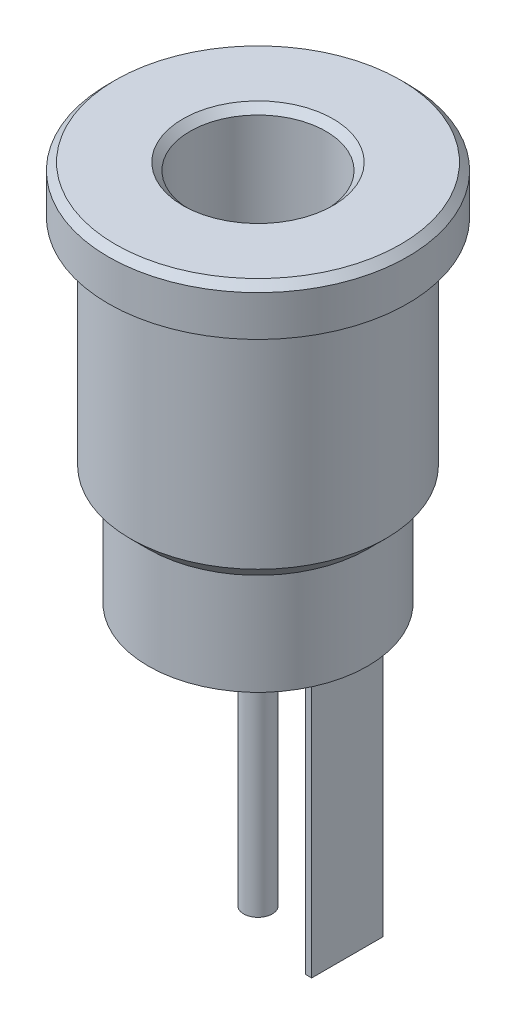
ISO-10303-21;
HEADER;
FILE_DESCRIPTION(('STEP AP214'),'2;1');
FILE_NAME('part.step','',(''),(''),'','','');
FILE_SCHEMA(('AUTOMOTIVE_DESIGN { 1 0 10303 214 1 1 1 1 }'));
ENDSEC;
DATA;
#1=APPLICATION_CONTEXT('core data for automotive mechanical design processes');
#2=APPLICATION_PROTOCOL_DEFINITION('international standard','automotive_design',2000,#1);
#3=PRODUCT_CONTEXT('',#1,'mechanical');
#4=PRODUCT('Part','Part','',(#3));
#5=PRODUCT_RELATED_PRODUCT_CATEGORY('part','',(#4));
#6=PRODUCT_DEFINITION_FORMATION('','',#4);
#7=PRODUCT_DEFINITION_CONTEXT('part definition',#1,'design');
#8=PRODUCT_DEFINITION('design','',#6,#7);
#9=PRODUCT_DEFINITION_SHAPE('','',#8);
#10=(LENGTH_UNIT() NAMED_UNIT(*) SI_UNIT(.MILLI.,.METRE.));
#11=(NAMED_UNIT(*) PLANE_ANGLE_UNIT() SI_UNIT($,.RADIAN.));
#12=(NAMED_UNIT(*) SI_UNIT($,.STERADIAN.) SOLID_ANGLE_UNIT());
#13=UNCERTAINTY_MEASURE_WITH_UNIT(LENGTH_MEASURE(1.E-05),#10,'distance_accuracy_value','');
#14=(GEOMETRIC_REPRESENTATION_CONTEXT(3) GLOBAL_UNCERTAINTY_ASSIGNED_CONTEXT((#13)) GLOBAL_UNIT_ASSIGNED_CONTEXT((#10,
#11,#12)) REPRESENTATION_CONTEXT('',''));
#15=CARTESIAN_POINT('',(0.,0.,0.));
#16=DIRECTION('',(0.,0.,1.));
#17=DIRECTION('',(1.,0.,0.));
#18=AXIS2_PLACEMENT_3D('',#15,#16,#17);
#19=CARTESIAN_POINT('',(0.,0.,0.));
#20=DIRECTION('',(0.,1.,0.));
#21=DIRECTION('',(0.,0.,1.));
#22=AXIS2_PLACEMENT_3D('',#19,#20,#21);
#23=PLANE('',#22);
#24=CARTESIAN_POINT('',(0.,0.,0.));
#25=DIRECTION('',(0.,1.,0.));
#26=DIRECTION('',(0.,0.,1.));
#27=AXIS2_PLACEMENT_3D('',#24,#25,#26);
#28=CIRCLE('',#27,0.6);
#29=CARTESIAN_POINT('',(0.,0.,0.6));
#30=VERTEX_POINT('',#29);
#31=EDGE_CURVE('E12',#30,#30,#28,.F.);
#32=ORIENTED_EDGE('',*,*,#31,.F.);
#33=EDGE_LOOP('',(#32));
#34=FACE_BOUND('',#33,.T.);
#35=CARTESIAN_POINT('',(0.,0.,0.));
#36=DIRECTION('',(0.,-1.,0.));
#37=DIRECTION('',(0.,0.,-1.));
#38=AXIS2_PLACEMENT_3D('',#35,#36,#37);
#39=CIRCLE('',#38,4.6);
#40=CARTESIAN_POINT('',(0.,0.,-4.6));
#41=VERTEX_POINT('',#40);
#42=EDGE_CURVE('E101',#41,#41,#39,.T.);
#43=ORIENTED_EDGE('',*,*,#42,.T.);
#44=EDGE_LOOP('',(#43));
#45=FACE_BOUND('',#44,.T.);
#46=DIRECTION('',(0.,0.,1.));
#47=VECTOR('',#46,1.);
#48=CARTESIAN_POINT('',(3.75,0.,1.5));
#49=LINE('',#48,#47);
#50=CARTESIAN_POINT('',(3.75,0.,-1.5));
#51=VERTEX_POINT('',#50);
#52=CARTESIAN_POINT('',(3.75,0.,1.5));
#53=VERTEX_POINT('',#52);
#54=EDGE_CURVE('E100',#51,#53,#49,.T.);
#55=ORIENTED_EDGE('',*,*,#54,.F.);
#56=DIRECTION('',(1.,0.,0.));
#57=VECTOR('',#56,1.);
#58=CARTESIAN_POINT('',(3.5,0.,-1.5));
#59=LINE('',#58,#57);
#60=CARTESIAN_POINT('',(3.5,0.,-1.5));
#61=VERTEX_POINT('',#60);
#62=EDGE_CURVE('E97',#61,#51,#59,.T.);
#63=ORIENTED_EDGE('',*,*,#62,.F.);
#64=DIRECTION('',(0.,0.,-1.));
#65=VECTOR('',#64,1.);
#66=CARTESIAN_POINT('',(3.5,0.,1.5));
#67=LINE('',#66,#65);
#68=CARTESIAN_POINT('',(3.5,0.,1.5));
#69=VERTEX_POINT('',#68);
#70=EDGE_CURVE('E59',#69,#61,#67,.T.);
#71=ORIENTED_EDGE('',*,*,#70,.F.);
#72=DIRECTION('',(-1.,0.,0.));
#73=VECTOR('',#72,1.);
#74=CARTESIAN_POINT('',(3.5,0.,1.5));
#75=LINE('',#74,#73);
#76=EDGE_CURVE('E54',#53,#69,#75,.T.);
#77=ORIENTED_EDGE('',*,*,#76,.F.);
#78=EDGE_LOOP('',(#55,#63,#71,#77));
#79=FACE_BOUND('',#78,.T.);
#80=ADVANCED_FACE('F38',(#34,#45,#79),#23,.F.);
#81=CARTESIAN_POINT('',(0.,14.,0.));
#82=DIRECTION('',(0.,-1.,0.));
#83=DIRECTION('',(0.,0.,-1.));
#84=AXIS2_PLACEMENT_3D('',#81,#82,#83);
#85=CYLINDRICAL_SURFACE('',#84,5.35);
#86=CARTESIAN_POINT('',(0.,5.00000000000001,0.));
#87=DIRECTION('',(0.,-1.,0.));
#88=DIRECTION('',(0.,0.,-1.));
#89=AXIS2_PLACEMENT_3D('',#86,#87,#88);
#90=CIRCLE('',#89,5.35);
#91=CARTESIAN_POINT('',(0.,5.00000000000001,-5.35));
#92=VERTEX_POINT('',#91);
#93=EDGE_CURVE('E136',#92,#92,#90,.F.);
#94=ORIENTED_EDGE('',*,*,#93,.T.);
#95=EDGE_LOOP('',(#94));
#96=FACE_BOUND('',#95,.T.);
#97=CARTESIAN_POINT('',(0.,14.,0.));
#98=DIRECTION('',(0.,1.,0.));
#99=DIRECTION('',(0.,0.,1.));
#100=AXIS2_PLACEMENT_3D('',#97,#98,#99);
#101=CIRCLE('',#100,5.35);
#102=CARTESIAN_POINT('',(0.,14.,5.35));
#103=VERTEX_POINT('',#102);
#104=EDGE_CURVE('E118',#103,#103,#101,.T.);
#105=ORIENTED_EDGE('',*,*,#104,.F.);
#106=EDGE_LOOP('',(#105));
#107=FACE_BOUND('',#106,.T.);
#108=ADVANCED_FACE('F155',(#96,#107),#85,.T.);
#109=CARTESIAN_POINT('',(0.,16.,0.));
#110=DIRECTION('',(0.,-1.,0.));
#111=DIRECTION('',(0.,0.,-1.));
#112=AXIS2_PLACEMENT_3D('',#109,#110,#111);
#113=CYLINDRICAL_SURFACE('',#112,6.275);
#114=CARTESIAN_POINT('',(0.,15.7,0.));
#115=DIRECTION('',(0.,1.,0.));
#116=DIRECTION('',(0.,0.,1.));
#117=AXIS2_PLACEMENT_3D('',#114,#115,#116);
#118=CIRCLE('',#117,6.275);
#119=CARTESIAN_POINT('',(0.,15.7,6.275));
#120=VERTEX_POINT('',#119);
#121=EDGE_CURVE('E130',#120,#120,#118,.F.);
#122=ORIENTED_EDGE('',*,*,#121,.T.);
#123=EDGE_LOOP('',(#122));
#124=FACE_BOUND('',#123,.T.);
#125=CARTESIAN_POINT('',(0.,14.,0.));
#126=DIRECTION('',(0.,1.,0.));
#127=DIRECTION('',(0.,0.,1.));
#128=AXIS2_PLACEMENT_3D('',#125,#126,#127);
#129=CIRCLE('',#128,6.275);
#130=CARTESIAN_POINT('',(0.,14.,6.275));
#131=VERTEX_POINT('',#130);
#132=EDGE_CURVE('E115',#131,#131,#129,.T.);
#133=ORIENTED_EDGE('',*,*,#132,.T.);
#134=EDGE_LOOP('',(#133));
#135=FACE_BOUND('',#134,.T.);
#136=ADVANCED_FACE('F161',(#124,#135),#113,.T.);
#137=CARTESIAN_POINT('',(0.,16.,0.));
#138=DIRECTION('',(0.,1.,0.));
#139=DIRECTION('',(0.,0.,1.));
#140=AXIS2_PLACEMENT_3D('',#137,#138,#139);
#141=PLANE('',#140);
#142=CARTESIAN_POINT('',(0.,16.,0.));
#143=DIRECTION('',(0.,1.,0.));
#144=DIRECTION('',(0.,0.,1.));
#145=AXIS2_PLACEMENT_3D('',#142,#143,#144);
#146=CIRCLE('',#145,5.975);
#147=CARTESIAN_POINT('',(0.,16.,5.975));
#148=VERTEX_POINT('',#147);
#149=EDGE_CURVE('E127',#148,#148,#146,.T.);
#150=ORIENTED_EDGE('',*,*,#149,.T.);
#151=EDGE_LOOP('',(#150));
#152=FACE_BOUND('',#151,.T.);
#153=CARTESIAN_POINT('',(0.,16.,0.));
#154=DIRECTION('',(0.,1.,0.));
#155=DIRECTION('',(0.,0.,1.));
#156=AXIS2_PLACEMENT_3D('',#153,#154,#155);
#157=CIRCLE('',#156,3.15);
#158=CARTESIAN_POINT('',(0.,16.,3.15));
#159=VERTEX_POINT('',#158);
#160=EDGE_CURVE('E124',#159,#159,#157,.F.);
#161=ORIENTED_EDGE('',*,*,#160,.T.);
#162=EDGE_LOOP('',(#161));
#163=FACE_BOUND('',#162,.T.);
#164=ADVANCED_FACE('F209',(#152,#163),#141,.T.);
#165=CARTESIAN_POINT('',(0.,14.,0.));
#166=DIRECTION('',(0.,1.,0.));
#167=DIRECTION('',(0.,0.,1.));
#168=AXIS2_PLACEMENT_3D('',#165,#166,#167);
#169=PLANE('',#168);
#170=ORIENTED_EDGE('',*,*,#104,.T.);
#171=EDGE_LOOP('',(#170));
#172=FACE_BOUND('',#171,.T.);
#173=ORIENTED_EDGE('',*,*,#132,.F.);
#174=EDGE_LOOP('',(#173));
#175=FACE_BOUND('',#174,.T.);
#176=ADVANCED_FACE('F195',(#172,#175),#169,.F.);
#177=CARTESIAN_POINT('',(0.,4.1,0.));
#178=DIRECTION('',(0.,1.,0.));
#179=DIRECTION('',(0.,0.,1.));
#180=AXIS2_PLACEMENT_3D('',#177,#178,#179);
#181=CYLINDRICAL_SURFACE('',#180,2.85);
#182=CARTESIAN_POINT('',(0.,15.7,0.));
#183=DIRECTION('',(0.,1.,0.));
#184=DIRECTION('',(0.,0.,1.));
#185=AXIS2_PLACEMENT_3D('',#182,#183,#184);
#186=CIRCLE('',#185,2.85);
#187=CARTESIAN_POINT('',(0.,15.7,2.85));
#188=VERTEX_POINT('',#187);
#189=EDGE_CURVE('E133',#188,#188,#186,.T.);
#190=ORIENTED_EDGE('',*,*,#189,.T.);
#191=EDGE_LOOP('',(#190));
#192=FACE_BOUND('',#191,.T.);
#193=CARTESIAN_POINT('',(0.,4.1,0.));
#194=DIRECTION('',(0.,1.,0.));
#195=DIRECTION('',(0.,0.,1.));
#196=AXIS2_PLACEMENT_3D('',#193,#194,#195);
#197=CIRCLE('',#196,2.85);
#198=CARTESIAN_POINT('',(0.,4.1,2.85));
#199=VERTEX_POINT('',#198);
#200=EDGE_CURVE('E112',#199,#199,#197,.T.);
#201=ORIENTED_EDGE('',*,*,#200,.F.);
#202=EDGE_LOOP('',(#201));
#203=FACE_BOUND('',#202,.T.);
#204=ADVANCED_FACE('F191',(#192,#203),#181,.F.);
#205=CARTESIAN_POINT('',(0.,4.1,0.));
#206=DIRECTION('',(0.,1.,0.));
#207=DIRECTION('',(0.,0.,1.));
#208=AXIS2_PLACEMENT_3D('',#205,#206,#207);
#209=PLANE('',#208);
#210=CARTESIAN_POINT('',(0.,4.1,0.));
#211=DIRECTION('',(0.,1.,0.));
#212=DIRECTION('',(0.,0.,1.));
#213=AXIS2_PLACEMENT_3D('',#210,#211,#212);
#214=CIRCLE('',#213,1.);
#215=CARTESIAN_POINT('',(0.,4.1,1.));
#216=VERTEX_POINT('',#215);
#217=EDGE_CURVE('E104',#216,#216,#214,.T.);
#218=ORIENTED_EDGE('',*,*,#217,.F.);
#219=EDGE_LOOP('',(#218));
#220=FACE_BOUND('',#219,.T.);
#221=ORIENTED_EDGE('',*,*,#200,.T.);
#222=EDGE_LOOP('',(#221));
#223=FACE_BOUND('',#222,.T.);
#224=ADVANCED_FACE('F194',(#220,#223),#209,.T.);
#225=CARTESIAN_POINT('',(0.,18.8284271247462,0.));
#226=DIRECTION('',(0.,-1.,0.));
#227=DIRECTION('',(0.,0.,-1.));
#228=AXIS2_PLACEMENT_3D('',#225,#226,#227);
#229=CYLINDRICAL_SURFACE('',#228,1.);
#230=CARTESIAN_POINT('',(0.,12.,0.));
#231=DIRECTION('',(0.,-1.,0.));
#232=DIRECTION('',(0.,0.,-1.));
#233=AXIS2_PLACEMENT_3D('',#230,#231,#232);
#234=CIRCLE('',#233,1.);
#235=CARTESIAN_POINT('',(0.,12.,-1.));
#236=VERTEX_POINT('',#235);
#237=EDGE_CURVE('E121',#236,#236,#234,.T.);
#238=ORIENTED_EDGE('',*,*,#237,.T.);
#239=EDGE_LOOP('',(#238));
#240=FACE_BOUND('',#239,.T.);
#241=ORIENTED_EDGE('',*,*,#217,.T.);
#242=EDGE_LOOP('',(#241));
#243=FACE_BOUND('',#242,.T.);
#244=ADVANCED_FACE('F173',(#240,#243),#229,.T.);
#245=CARTESIAN_POINT('',(0.,12.,0.));
#246=DIRECTION('',(0.,1.,0.));
#247=DIRECTION('',(0.,0.,1.));
#248=AXIS2_PLACEMENT_3D('',#245,#246,#247);
#249=SPHERICAL_SURFACE('',#248,1.);
#250=ORIENTED_EDGE('',*,*,#237,.F.);
#251=EDGE_LOOP('',(#250));
#252=FACE_BOUND('',#251,.T.);
#253=ADVANCED_FACE('F169',(#252),#249,.T.);
#254=CARTESIAN_POINT('',(0.,16.,0.));
#255=DIRECTION('',(0.,-1.,0.));
#256=DIRECTION('',(0.,0.,-1.));
#257=AXIS2_PLACEMENT_3D('',#254,#255,#256);
#258=CONICAL_SURFACE('',#257,5.975,0.785398163397444);
#259=ORIENTED_EDGE('',*,*,#121,.F.);
#260=EDGE_LOOP('',(#259));
#261=FACE_BOUND('',#260,.T.);
#262=ORIENTED_EDGE('',*,*,#149,.F.);
#263=EDGE_LOOP('',(#262));
#264=FACE_BOUND('',#263,.T.);
#265=ADVANCED_FACE('F172',(#261,#264),#258,.T.);
#266=CARTESIAN_POINT('',(0.,15.7,0.));
#267=DIRECTION('',(0.,1.,0.));
#268=DIRECTION('',(0.,0.,1.));
#269=AXIS2_PLACEMENT_3D('',#266,#267,#268);
#270=CONICAL_SURFACE('',#269,2.85,0.785398163397445);
#271=ORIENTED_EDGE('',*,*,#160,.F.);
#272=EDGE_LOOP('',(#271));
#273=FACE_BOUND('',#272,.T.);
#274=ORIENTED_EDGE('',*,*,#189,.F.);
#275=EDGE_LOOP('',(#274));
#276=FACE_BOUND('',#275,.T.);
#277=ADVANCED_FACE('F151',(#273,#276),#270,.F.);
#278=CARTESIAN_POINT('',(0.,4.,0.));
#279=DIRECTION('',(0.,-1.,0.));
#280=DIRECTION('',(0.,0.,-1.));
#281=AXIS2_PLACEMENT_3D('',#278,#279,#280);
#282=CYLINDRICAL_SURFACE('',#281,4.6);
#283=CARTESIAN_POINT('',(0.,4.25000000000001,0.));
#284=DIRECTION('',(0.,1.,0.));
#285=DIRECTION('',(0.,0.,1.));
#286=AXIS2_PLACEMENT_3D('',#283,#284,#285);
#287=CIRCLE('',#286,4.6);
#288=CARTESIAN_POINT('',(0.,4.25000000000001,4.6));
#289=VERTEX_POINT('',#288);
#290=EDGE_CURVE('E47',#289,#289,#287,.F.);
#291=ORIENTED_EDGE('',*,*,#290,.T.);
#292=EDGE_LOOP('',(#291));
#293=FACE_BOUND('',#292,.T.);
#294=ORIENTED_EDGE('',*,*,#42,.F.);
#295=EDGE_LOOP('',(#294));
#296=FACE_BOUND('',#295,.T.);
#297=ADVANCED_FACE('F141',(#293,#296),#282,.T.);
#298=CARTESIAN_POINT('',(0.,4.,0.));
#299=DIRECTION('',(0.,1.,0.));
#300=DIRECTION('',(0.,0.,1.));
#301=AXIS2_PLACEMENT_3D('',#298,#299,#300);
#302=CONICAL_SURFACE('',#301,4.34999999999998,0.785398163397454);
#303=ORIENTED_EDGE('',*,*,#93,.F.);
#304=EDGE_LOOP('',(#303));
#305=FACE_BOUND('',#304,.T.);
#306=ORIENTED_EDGE('',*,*,#290,.F.);
#307=EDGE_LOOP('',(#306));
#308=FACE_BOUND('',#307,.T.);
#309=ADVANCED_FACE('F41',(#305,#308),#302,.T.);
#310=CARTESIAN_POINT('',(3.75,-11.,1.5));
#311=DIRECTION('',(-1.,0.,0.));
#312=DIRECTION('',(0.,0.,1.));
#313=AXIS2_PLACEMENT_3D('',#310,#311,#312);
#314=PLANE('',#313);
#315=ORIENTED_EDGE('',*,*,#54,.T.);
#316=DIRECTION('',(0.,1.,0.));
#317=VECTOR('',#316,1.);
#318=CARTESIAN_POINT('',(3.75,-11.,1.5));
#319=LINE('',#318,#317);
#320=CARTESIAN_POINT('',(3.75,-11.,1.5));
#321=VERTEX_POINT('',#320);
#322=EDGE_CURVE('E81',#321,#53,#319,.T.);
#323=ORIENTED_EDGE('',*,*,#322,.F.);
#324=DIRECTION('',(0.,0.,1.));
#325=VECTOR('',#324,1.);
#326=CARTESIAN_POINT('',(3.75,-11.,1.5));
#327=LINE('',#326,#325);
#328=CARTESIAN_POINT('',(3.75,-11.,-1.5));
#329=VERTEX_POINT('',#328);
#330=EDGE_CURVE('E88',#329,#321,#327,.T.);
#331=ORIENTED_EDGE('',*,*,#330,.F.);
#332=DIRECTION('',(0.,1.,0.));
#333=VECTOR('',#332,1.);
#334=CARTESIAN_POINT('',(3.75,-11.,-1.5));
#335=LINE('',#334,#333);
#336=EDGE_CURVE('E345',#329,#51,#335,.T.);
#337=ORIENTED_EDGE('',*,*,#336,.T.);
#338=EDGE_LOOP('',(#315,#323,#331,#337));
#339=FACE_BOUND('',#338,.T.);
#340=ADVANCED_FACE('F99',(#339),#314,.F.);
#341=CARTESIAN_POINT('',(3.5,-11.,1.5));
#342=DIRECTION('',(0.,0.,-1.));
#343=DIRECTION('',(-1.,0.,0.));
#344=AXIS2_PLACEMENT_3D('',#341,#342,#343);
#345=PLANE('',#344);
#346=ORIENTED_EDGE('',*,*,#76,.T.);
#347=DIRECTION('',(0.,1.,0.));
#348=VECTOR('',#347,1.);
#349=CARTESIAN_POINT('',(3.5,-11.,1.5));
#350=LINE('',#349,#348);
#351=CARTESIAN_POINT('',(3.5,-11.,1.5));
#352=VERTEX_POINT('',#351);
#353=EDGE_CURVE('E84',#352,#69,#350,.T.);
#354=ORIENTED_EDGE('',*,*,#353,.F.);
#355=DIRECTION('',(-1.,0.,0.));
#356=VECTOR('',#355,1.);
#357=CARTESIAN_POINT('',(3.5,-11.,1.5));
#358=LINE('',#357,#356);
#359=EDGE_CURVE('E77',#321,#352,#358,.T.);
#360=ORIENTED_EDGE('',*,*,#359,.F.);
#361=ORIENTED_EDGE('',*,*,#322,.T.);
#362=EDGE_LOOP('',(#346,#354,#360,#361));
#363=FACE_BOUND('',#362,.T.);
#364=ADVANCED_FACE('F79',(#363),#345,.F.);
#365=CARTESIAN_POINT('',(3.5,-11.,1.5));
#366=DIRECTION('',(1.,0.,0.));
#367=DIRECTION('',(0.,0.,-1.));
#368=AXIS2_PLACEMENT_3D('',#365,#366,#367);
#369=PLANE('',#368);
#370=ORIENTED_EDGE('',*,*,#70,.T.);
#371=DIRECTION('',(0.,1.,0.));
#372=VECTOR('',#371,1.);
#373=CARTESIAN_POINT('',(3.5,-11.,-1.5));
#374=LINE('',#373,#372);
#375=CARTESIAN_POINT('',(3.5,-11.,-1.5));
#376=VERTEX_POINT('',#375);
#377=EDGE_CURVE('E106',#376,#61,#374,.T.);
#378=ORIENTED_EDGE('',*,*,#377,.F.);
#379=DIRECTION('',(0.,0.,-1.));
#380=VECTOR('',#379,1.);
#381=CARTESIAN_POINT('',(3.5,-11.,1.5));
#382=LINE('',#381,#380);
#383=EDGE_CURVE('E87',#352,#376,#382,.T.);
#384=ORIENTED_EDGE('',*,*,#383,.F.);
#385=ORIENTED_EDGE('',*,*,#353,.T.);
#386=EDGE_LOOP('',(#370,#378,#384,#385));
#387=FACE_BOUND('',#386,.T.);
#388=ADVANCED_FACE('F287',(#387),#369,.F.);
#389=CARTESIAN_POINT('',(3.5,-11.,-1.5));
#390=DIRECTION('',(0.,0.,1.));
#391=DIRECTION('',(1.,0.,0.));
#392=AXIS2_PLACEMENT_3D('',#389,#390,#391);
#393=PLANE('',#392);
#394=ORIENTED_EDGE('',*,*,#62,.T.);
#395=ORIENTED_EDGE('',*,*,#336,.F.);
#396=DIRECTION('',(1.,0.,0.));
#397=VECTOR('',#396,1.);
#398=CARTESIAN_POINT('',(3.5,-11.,-1.5));
#399=LINE('',#398,#397);
#400=EDGE_CURVE('E93',#376,#329,#399,.T.);
#401=ORIENTED_EDGE('',*,*,#400,.F.);
#402=ORIENTED_EDGE('',*,*,#377,.T.);
#403=EDGE_LOOP('',(#394,#395,#401,#402));
#404=FACE_BOUND('',#403,.T.);
#405=ADVANCED_FACE('F296',(#404),#393,.F.);
#406=CARTESIAN_POINT('',(0.,-11.,0.));
#407=DIRECTION('',(0.,-1.,0.));
#408=DIRECTION('',(0.,0.,-1.));
#409=AXIS2_PLACEMENT_3D('',#406,#407,#408);
#410=PLANE('',#409);
#411=ORIENTED_EDGE('',*,*,#330,.T.);
#412=ORIENTED_EDGE('',*,*,#359,.T.);
#413=ORIENTED_EDGE('',*,*,#383,.T.);
#414=ORIENTED_EDGE('',*,*,#400,.T.);
#415=EDGE_LOOP('',(#411,#412,#413,#414));
#416=FACE_BOUND('',#415,.T.);
#417=ADVANCED_FACE('F91',(#416),#410,.T.);
#418=CARTESIAN_POINT('',(0.,-11.,0.));
#419=DIRECTION('',(0.,1.,0.));
#420=DIRECTION('',(0.,0.,1.));
#421=AXIS2_PLACEMENT_3D('',#418,#419,#420);
#422=CYLINDRICAL_SURFACE('',#421,0.6);
#423=CARTESIAN_POINT('',(0.,-11.,0.));
#424=DIRECTION('',(0.,-1.,0.));
#425=DIRECTION('',(0.,0.,-1.));
#426=AXIS2_PLACEMENT_3D('',#423,#424,#425);
#427=CIRCLE('',#426,0.6);
#428=CARTESIAN_POINT('',(0.,-11.,-0.6));
#429=VERTEX_POINT('',#428);
#430=EDGE_CURVE('E340',#429,#429,#427,.T.);
#431=ORIENTED_EDGE('',*,*,#430,.F.);
#432=EDGE_LOOP('',(#431));
#433=FACE_BOUND('',#432,.T.);
#434=ORIENTED_EDGE('',*,*,#31,.T.);
#435=EDGE_LOOP('',(#434));
#436=FACE_BOUND('',#435,.T.);
#437=ADVANCED_FACE('F315',(#433,#436),#422,.T.);
#438=CARTESIAN_POINT('',(0.,-11.,0.));
#439=DIRECTION('',(0.,-1.,0.));
#440=DIRECTION('',(0.,0.,-1.));
#441=AXIS2_PLACEMENT_3D('',#438,#439,#440);
#442=PLANE('',#441);
#443=ORIENTED_EDGE('',*,*,#430,.T.);
#444=EDGE_LOOP('',(#443));
#445=FACE_BOUND('',#444,.T.);
#446=ADVANCED_FACE('F324',(#445),#442,.T.);
#447=CLOSED_SHELL('',(#80,#108,#136,#164,#176,#204,#224,#244,#253,#265,#277,#297,#309,#340,#364,
#388,#405,#417,#437,#446));
#448=MANIFOLD_SOLID_BREP('B2',#447);
#449=ADVANCED_BREP_SHAPE_REPRESENTATION('',(#18,#448),#14);
#450=SHAPE_DEFINITION_REPRESENTATION(#9,#449);
ENDSEC;
END-ISO-10303-21;
